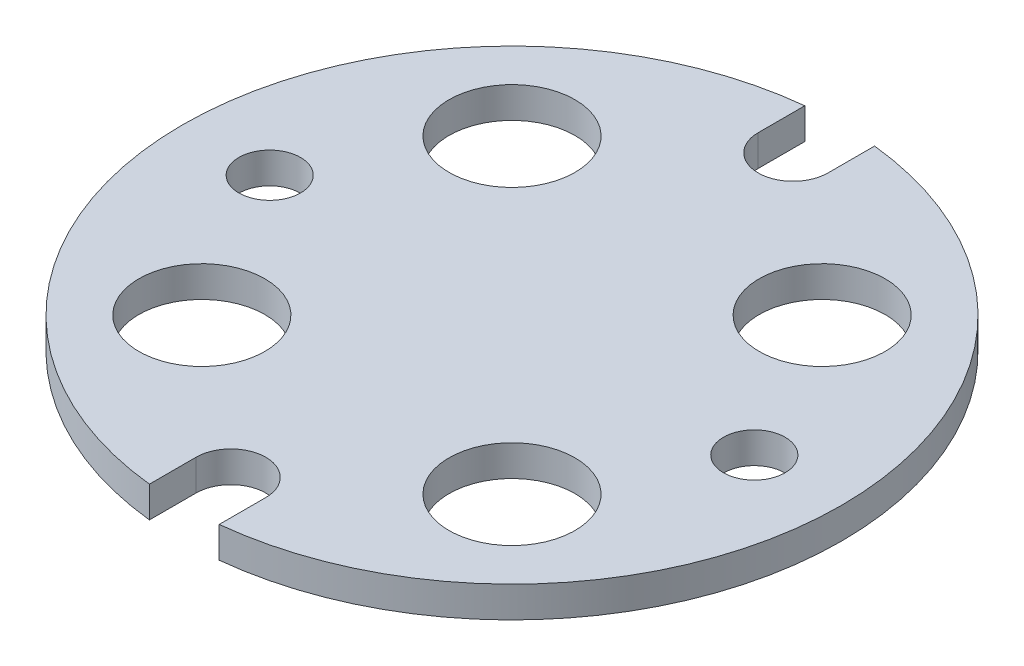
ISO-10303-21;
HEADER;
FILE_DESCRIPTION(('STEP AP214'),'2;1');
FILE_NAME('part.step','',(''),(''),'','','');
FILE_SCHEMA(('AUTOMOTIVE_DESIGN { 1 0 10303 214 1 1 1 1 }'));
ENDSEC;
DATA;
#1=APPLICATION_CONTEXT('core data for automotive mechanical design processes');
#2=APPLICATION_PROTOCOL_DEFINITION('international standard','automotive_design',2000,#1);
#3=PRODUCT_CONTEXT('',#1,'mechanical');
#4=PRODUCT('Part','Part','',(#3));
#5=PRODUCT_RELATED_PRODUCT_CATEGORY('part','',(#4));
#6=PRODUCT_DEFINITION_FORMATION('','',#4);
#7=PRODUCT_DEFINITION_CONTEXT('part definition',#1,'design');
#8=PRODUCT_DEFINITION('design','',#6,#7);
#9=PRODUCT_DEFINITION_SHAPE('','',#8);
#10=(LENGTH_UNIT() NAMED_UNIT(*) SI_UNIT(.MILLI.,.METRE.));
#11=(NAMED_UNIT(*) PLANE_ANGLE_UNIT() SI_UNIT($,.RADIAN.));
#12=(NAMED_UNIT(*) SI_UNIT($,.STERADIAN.) SOLID_ANGLE_UNIT());
#13=UNCERTAINTY_MEASURE_WITH_UNIT(LENGTH_MEASURE(1.E-05),#10,'distance_accuracy_value','');
#14=(GEOMETRIC_REPRESENTATION_CONTEXT(3) GLOBAL_UNCERTAINTY_ASSIGNED_CONTEXT((#13)) GLOBAL_UNIT_ASSIGNED_CONTEXT((#10,
#11,#12)) REPRESENTATION_CONTEXT('',''));
#15=CARTESIAN_POINT('',(0.,0.,0.));
#16=DIRECTION('',(0.,0.,1.));
#17=DIRECTION('',(1.,0.,0.));
#18=AXIS2_PLACEMENT_3D('',#15,#16,#17);
#19=CARTESIAN_POINT('',(0.,1.6,0.));
#20=DIRECTION('',(0.,-1.,0.));
#21=DIRECTION('',(0.,0.,-1.));
#22=AXIS2_PLACEMENT_3D('',#19,#20,#21);
#23=CYLINDRICAL_SURFACE('',#22,17.);
#24=CARTESIAN_POINT('',(0.,0.,0.));
#25=DIRECTION('',(0.,1.,0.));
#26=DIRECTION('',(0.,0.,1.));
#27=AXIS2_PLACEMENT_3D('',#24,#25,#26);
#28=CIRCLE('',#27,17.);
#29=CARTESIAN_POINT('',(1.80000000000001,0.,16.9044372872923));
#30=VERTEX_POINT('',#29);
#31=CARTESIAN_POINT('',(1.79999999999796,0.,-16.9044372872926));
#32=VERTEX_POINT('',#31);
#33=EDGE_CURVE('E38',#30,#32,#28,.T.);
#34=ORIENTED_EDGE('',*,*,#33,.T.);
#35=DIRECTION('',(0.,-1.,0.));
#36=VECTOR('',#35,1.);
#37=CARTESIAN_POINT('',(1.79999999999796,1.6,-16.9044372872926));
#38=LINE('',#37,#36);
#39=CARTESIAN_POINT('',(1.79999999999796,1.6,-16.9044372872926));
#40=VERTEX_POINT('',#39);
#41=EDGE_CURVE('E133',#40,#32,#38,.T.);
#42=ORIENTED_EDGE('',*,*,#41,.F.);
#43=CARTESIAN_POINT('',(0.,1.6,0.));
#44=DIRECTION('',(0.,1.,0.));
#45=DIRECTION('',(0.,0.,1.));
#46=AXIS2_PLACEMENT_3D('',#43,#44,#45);
#47=CIRCLE('',#46,17.);
#48=CARTESIAN_POINT('',(1.80000000000001,1.6,16.9044372872923));
#49=VERTEX_POINT('',#48);
#50=EDGE_CURVE('E11',#49,#40,#47,.T.);
#51=ORIENTED_EDGE('',*,*,#50,.F.);
#52=DIRECTION('',(0.,-1.,0.));
#53=VECTOR('',#52,1.);
#54=CARTESIAN_POINT('',(1.80000000000001,1.6,16.9044372872923));
#55=LINE('',#54,#53);
#56=EDGE_CURVE('E182',#49,#30,#55,.T.);
#57=ORIENTED_EDGE('',*,*,#56,.T.);
#58=EDGE_LOOP('',(#34,#42,#51,#57));
#59=FACE_BOUND('',#58,.T.);
#60=ADVANCED_FACE('F34',(#59),#23,.T.);
#61=CARTESIAN_POINT('',(-1.80000000000203,1.6,-16.9044372872921));
#62=VERTEX_POINT('',#61);
#63=CARTESIAN_POINT('',(-1.79999999999999,1.6,16.9044372872924));
#64=VERTEX_POINT('',#63);
#65=EDGE_CURVE('E43',#62,#64,#47,.T.);
#66=ORIENTED_EDGE('',*,*,#65,.F.);
#67=DIRECTION('',(0.,-1.,0.));
#68=VECTOR('',#67,1.);
#69=CARTESIAN_POINT('',(-1.80000000000203,1.6,-16.9044372872921));
#70=LINE('',#69,#68);
#71=CARTESIAN_POINT('',(-1.80000000000203,0.,-16.9044372872921));
#72=VERTEX_POINT('',#71);
#73=EDGE_CURVE('E106',#62,#72,#70,.T.);
#74=ORIENTED_EDGE('',*,*,#73,.T.);
#75=CARTESIAN_POINT('',(-1.79999999999999,0.,16.9044372872924));
#76=VERTEX_POINT('',#75);
#77=EDGE_CURVE('E189',#72,#76,#28,.T.);
#78=ORIENTED_EDGE('',*,*,#77,.T.);
#79=DIRECTION('',(0.,-1.,0.));
#80=VECTOR('',#79,1.);
#81=CARTESIAN_POINT('',(-1.79999999999999,1.6,16.9044372872924));
#82=LINE('',#81,#80);
#83=EDGE_CURVE('E180',#64,#76,#82,.T.);
#84=ORIENTED_EDGE('',*,*,#83,.F.);
#85=EDGE_LOOP('',(#66,#74,#78,#84));
#86=FACE_BOUND('',#85,.T.);
#87=ADVANCED_FACE('F36',(#86),#23,.T.);
#88=CARTESIAN_POINT('',(0.,1.6,0.));
#89=DIRECTION('',(0.,1.,0.));
#90=DIRECTION('',(0.,0.,1.));
#91=AXIS2_PLACEMENT_3D('',#88,#89,#90);
#92=PLANE('',#91);
#93=CARTESIAN_POINT('',(8.00000000000053,1.6,-8.));
#94=DIRECTION('',(0.,-1.,0.));
#95=DIRECTION('',(0.,0.,-1.));
#96=AXIS2_PLACEMENT_3D('',#93,#94,#95);
#97=CIRCLE('',#96,3.25);
#98=CARTESIAN_POINT('',(8.00000000000053,1.6,-11.25));
#99=VERTEX_POINT('',#98);
#100=EDGE_CURVE('E136',#99,#99,#97,.T.);
#101=ORIENTED_EDGE('',*,*,#100,.T.);
#102=EDGE_LOOP('',(#101));
#103=FACE_BOUND('',#102,.T.);
#104=CARTESIAN_POINT('',(-7.99999999999947,1.6,-8.00000000000053));
#105=DIRECTION('',(0.,-1.,0.));
#106=DIRECTION('',(0.,0.,-1.));
#107=AXIS2_PLACEMENT_3D('',#104,#105,#106);
#108=CIRCLE('',#107,3.25);
#109=CARTESIAN_POINT('',(-7.99999999999947,1.6,-11.2500000000005));
#110=VERTEX_POINT('',#109);
#111=EDGE_CURVE('E142',#110,#110,#108,.T.);
#112=ORIENTED_EDGE('',*,*,#111,.T.);
#113=EDGE_LOOP('',(#112));
#114=FACE_BOUND('',#113,.T.);
#115=CARTESIAN_POINT('',(-8.,1.6,7.99999999999947));
#116=DIRECTION('',(0.,-1.,0.));
#117=DIRECTION('',(0.,0.,-1.));
#118=AXIS2_PLACEMENT_3D('',#115,#116,#117);
#119=CIRCLE('',#118,3.25);
#120=CARTESIAN_POINT('',(-8.,1.6,4.74999999999947));
#121=VERTEX_POINT('',#120);
#122=EDGE_CURVE('E148',#121,#121,#119,.T.);
#123=ORIENTED_EDGE('',*,*,#122,.T.);
#124=EDGE_LOOP('',(#123));
#125=FACE_BOUND('',#124,.T.);
#126=DIRECTION('',(1.20034163436477E-13,0.,1.));
#127=VECTOR('',#126,1.);
#128=CARTESIAN_POINT('',(1.79999999999825,1.6,-14.5));
#129=LINE('',#128,#127);
#130=CARTESIAN_POINT('',(1.79999999999825,1.6,-14.5));
#131=VERTEX_POINT('',#130);
#132=EDGE_CURVE('E107',#40,#131,#129,.T.);
#133=ORIENTED_EDGE('',*,*,#132,.T.);
#134=CARTESIAN_POINT('',(-1.74775222975309E-12,1.6,-14.4999999999997));
#135=DIRECTION('',(0.,-1.,0.));
#136=DIRECTION('',(0.,0.,-1.));
#137=AXIS2_PLACEMENT_3D('',#134,#135,#136);
#138=CIRCLE('',#137,1.8);
#139=CARTESIAN_POINT('',(-1.80000000000175,1.6,-14.4999999999995));
#140=VERTEX_POINT('',#139);
#141=EDGE_CURVE('E102',#131,#140,#138,.T.);
#142=ORIENTED_EDGE('',*,*,#141,.T.);
#143=DIRECTION('',(-1.20034163436477E-13,0.,-1.));
#144=VECTOR('',#143,1.);
#145=CARTESIAN_POINT('',(-1.80000000000175,1.6,-14.4999999999995));
#146=LINE('',#145,#144);
#147=EDGE_CURVE('E110',#140,#62,#146,.T.);
#148=ORIENTED_EDGE('',*,*,#147,.T.);
#149=ORIENTED_EDGE('',*,*,#65,.T.);
#150=DIRECTION('',(0.,0.,-1.));
#151=VECTOR('',#150,1.);
#152=CARTESIAN_POINT('',(-1.79999999999999,1.6,14.4999999999997));
#153=LINE('',#152,#151);
#154=CARTESIAN_POINT('',(-1.79999999999999,1.6,14.4999999999997));
#155=VERTEX_POINT('',#154);
#156=EDGE_CURVE('E170',#64,#155,#153,.T.);
#157=ORIENTED_EDGE('',*,*,#156,.T.);
#158=CARTESIAN_POINT('',(0.,1.6,14.4999999999997));
#159=DIRECTION('',(0.,-1.,0.));
#160=DIRECTION('',(0.,0.,-1.));
#161=AXIS2_PLACEMENT_3D('',#158,#159,#160);
#162=CIRCLE('',#161,1.8);
#163=CARTESIAN_POINT('',(1.80000000000001,1.6,14.4999999999997));
#164=VERTEX_POINT('',#163);
#165=EDGE_CURVE('E163',#155,#164,#162,.T.);
#166=ORIENTED_EDGE('',*,*,#165,.T.);
#167=DIRECTION('',(0.,0.,1.));
#168=VECTOR('',#167,1.);
#169=CARTESIAN_POINT('',(1.80000000000001,1.6,14.4999999999997));
#170=LINE('',#169,#168);
#171=EDGE_CURVE('E166',#164,#49,#170,.T.);
#172=ORIENTED_EDGE('',*,*,#171,.T.);
#173=ORIENTED_EDGE('',*,*,#50,.T.);
#174=EDGE_LOOP('',(#133,#142,#148,#149,#157,#166,#172,#173));
#175=FACE_BOUND('',#174,.T.);
#176=CARTESIAN_POINT('',(8.,1.6,8.));
#177=DIRECTION('',(0.,-1.,0.));
#178=DIRECTION('',(0.,0.,-1.));
#179=AXIS2_PLACEMENT_3D('',#176,#177,#178);
#180=CIRCLE('',#179,3.25);
#181=CARTESIAN_POINT('',(8.,1.6,4.75));
#182=VERTEX_POINT('',#181);
#183=EDGE_CURVE('E156',#182,#182,#180,.T.);
#184=ORIENTED_EDGE('',*,*,#183,.T.);
#185=EDGE_LOOP('',(#184));
#186=FACE_BOUND('',#185,.T.);
#187=CARTESIAN_POINT('',(-12.5,1.6,0.));
#188=DIRECTION('',(0.,-1.,0.));
#189=DIRECTION('',(0.,0.,-1.));
#190=AXIS2_PLACEMENT_3D('',#187,#188,#189);
#191=CIRCLE('',#190,1.59);
#192=CARTESIAN_POINT('',(-12.5,1.6,-1.59));
#193=VERTEX_POINT('',#192);
#194=EDGE_CURVE('E149',#193,#193,#191,.T.);
#195=ORIENTED_EDGE('',*,*,#194,.T.);
#196=EDGE_LOOP('',(#195));
#197=FACE_BOUND('',#196,.T.);
#198=CARTESIAN_POINT('',(12.5,1.6,0.));
#199=DIRECTION('',(0.,-1.,0.));
#200=DIRECTION('',(0.,0.,-1.));
#201=AXIS2_PLACEMENT_3D('',#198,#199,#200);
#202=CIRCLE('',#201,1.59);
#203=CARTESIAN_POINT('',(12.5,1.6,-1.59));
#204=VERTEX_POINT('',#203);
#205=EDGE_CURVE('E186',#204,#204,#202,.T.);
#206=ORIENTED_EDGE('',*,*,#205,.T.);
#207=EDGE_LOOP('',(#206));
#208=FACE_BOUND('',#207,.T.);
#209=ADVANCED_FACE('F117',(#103,#114,#125,#175,#186,#197,#208),#92,.T.);
#210=CARTESIAN_POINT('',(0.,0.,0.));
#211=DIRECTION('',(0.,1.,0.));
#212=DIRECTION('',(0.,0.,1.));
#213=AXIS2_PLACEMENT_3D('',#210,#211,#212);
#214=PLANE('',#213);
#215=CARTESIAN_POINT('',(8.00000000000053,0.,-8.));
#216=DIRECTION('',(0.,-1.,0.));
#217=DIRECTION('',(0.,0.,-1.));
#218=AXIS2_PLACEMENT_3D('',#215,#216,#217);
#219=CIRCLE('',#218,3.25);
#220=CARTESIAN_POINT('',(8.00000000000053,0.,-11.25));
#221=VERTEX_POINT('',#220);
#222=EDGE_CURVE('E139',#221,#221,#219,.T.);
#223=ORIENTED_EDGE('',*,*,#222,.F.);
#224=EDGE_LOOP('',(#223));
#225=FACE_BOUND('',#224,.T.);
#226=CARTESIAN_POINT('',(-7.99999999999947,0.,-8.00000000000053));
#227=DIRECTION('',(0.,-1.,0.));
#228=DIRECTION('',(0.,0.,-1.));
#229=AXIS2_PLACEMENT_3D('',#226,#227,#228);
#230=CIRCLE('',#229,3.25);
#231=CARTESIAN_POINT('',(-7.99999999999947,0.,-11.2500000000005));
#232=VERTEX_POINT('',#231);
#233=EDGE_CURVE('E145',#232,#232,#230,.T.);
#234=ORIENTED_EDGE('',*,*,#233,.F.);
#235=EDGE_LOOP('',(#234));
#236=FACE_BOUND('',#235,.T.);
#237=CARTESIAN_POINT('',(-8.,0.,7.99999999999947));
#238=DIRECTION('',(0.,-1.,0.));
#239=DIRECTION('',(0.,0.,-1.));
#240=AXIS2_PLACEMENT_3D('',#237,#238,#239);
#241=CIRCLE('',#240,3.25);
#242=CARTESIAN_POINT('',(-8.,0.,4.74999999999947));
#243=VERTEX_POINT('',#242);
#244=EDGE_CURVE('E125',#243,#243,#241,.T.);
#245=ORIENTED_EDGE('',*,*,#244,.F.);
#246=EDGE_LOOP('',(#245));
#247=FACE_BOUND('',#246,.T.);
#248=CARTESIAN_POINT('',(8.,0.,8.));
#249=DIRECTION('',(0.,-1.,0.));
#250=DIRECTION('',(0.,0.,-1.));
#251=AXIS2_PLACEMENT_3D('',#248,#249,#250);
#252=CIRCLE('',#251,3.25);
#253=CARTESIAN_POINT('',(8.,0.,4.75));
#254=VERTEX_POINT('',#253);
#255=EDGE_CURVE('E159',#254,#254,#252,.T.);
#256=ORIENTED_EDGE('',*,*,#255,.F.);
#257=EDGE_LOOP('',(#256));
#258=FACE_BOUND('',#257,.T.);
#259=CARTESIAN_POINT('',(-12.5,0.,0.));
#260=DIRECTION('',(0.,-1.,0.));
#261=DIRECTION('',(0.,0.,-1.));
#262=AXIS2_PLACEMENT_3D('',#259,#260,#261);
#263=CIRCLE('',#262,1.59);
#264=CARTESIAN_POINT('',(-12.5,0.,-1.59));
#265=VERTEX_POINT('',#264);
#266=EDGE_CURVE('E153',#265,#265,#263,.T.);
#267=ORIENTED_EDGE('',*,*,#266,.F.);
#268=EDGE_LOOP('',(#267));
#269=FACE_BOUND('',#268,.T.);
#270=CARTESIAN_POINT('',(12.5,0.,0.));
#271=DIRECTION('',(0.,-1.,0.));
#272=DIRECTION('',(0.,0.,-1.));
#273=AXIS2_PLACEMENT_3D('',#270,#271,#272);
#274=CIRCLE('',#273,1.59);
#275=CARTESIAN_POINT('',(12.5,0.,-1.59));
#276=VERTEX_POINT('',#275);
#277=EDGE_CURVE('E152',#276,#276,#274,.T.);
#278=ORIENTED_EDGE('',*,*,#277,.F.);
#279=EDGE_LOOP('',(#278));
#280=FACE_BOUND('',#279,.T.);
#281=CARTESIAN_POINT('',(-1.74775222975309E-12,0.,-14.4999999999997));
#282=DIRECTION('',(0.,-1.,0.));
#283=DIRECTION('',(0.,0.,-1.));
#284=AXIS2_PLACEMENT_3D('',#281,#282,#283);
#285=CIRCLE('',#284,1.8);
#286=CARTESIAN_POINT('',(1.79999999999825,0.,-14.5));
#287=VERTEX_POINT('',#286);
#288=CARTESIAN_POINT('',(-1.80000000000175,0.,-14.4999999999995));
#289=VERTEX_POINT('',#288);
#290=EDGE_CURVE('E50',#287,#289,#285,.T.);
#291=ORIENTED_EDGE('',*,*,#290,.F.);
#292=DIRECTION('',(1.20034163436477E-13,0.,1.));
#293=VECTOR('',#292,1.);
#294=CARTESIAN_POINT('',(1.79999999999825,0.,-14.5));
#295=LINE('',#294,#293);
#296=EDGE_CURVE('E119',#32,#287,#295,.T.);
#297=ORIENTED_EDGE('',*,*,#296,.F.);
#298=ORIENTED_EDGE('',*,*,#33,.F.);
#299=DIRECTION('',(0.,0.,1.));
#300=VECTOR('',#299,1.);
#301=CARTESIAN_POINT('',(1.80000000000001,0.,14.4999999999997));
#302=LINE('',#301,#300);
#303=CARTESIAN_POINT('',(1.80000000000001,0.,14.4999999999997));
#304=VERTEX_POINT('',#303);
#305=EDGE_CURVE('E175',#304,#30,#302,.T.);
#306=ORIENTED_EDGE('',*,*,#305,.F.);
#307=CARTESIAN_POINT('',(0.,0.,14.4999999999997));
#308=DIRECTION('',(0.,-1.,0.));
#309=DIRECTION('',(0.,0.,-1.));
#310=AXIS2_PLACEMENT_3D('',#307,#308,#309);
#311=CIRCLE('',#310,1.8);
#312=CARTESIAN_POINT('',(-1.79999999999999,0.,14.4999999999997));
#313=VERTEX_POINT('',#312);
#314=EDGE_CURVE('E58',#313,#304,#311,.T.);
#315=ORIENTED_EDGE('',*,*,#314,.F.);
#316=DIRECTION('',(0.,0.,-1.));
#317=VECTOR('',#316,1.);
#318=CARTESIAN_POINT('',(-1.79999999999999,0.,14.4999999999997));
#319=LINE('',#318,#317);
#320=EDGE_CURVE('E167',#76,#313,#319,.T.);
#321=ORIENTED_EDGE('',*,*,#320,.F.);
#322=ORIENTED_EDGE('',*,*,#77,.F.);
#323=DIRECTION('',(-1.20034163436477E-13,0.,-1.));
#324=VECTOR('',#323,1.);
#325=CARTESIAN_POINT('',(-1.80000000000175,0.,-14.4999999999995));
#326=LINE('',#325,#324);
#327=EDGE_CURVE('E122',#289,#72,#326,.T.);
#328=ORIENTED_EDGE('',*,*,#327,.F.);
#329=EDGE_LOOP('',(#291,#297,#298,#306,#315,#321,#322,#328));
#330=FACE_BOUND('',#329,.T.);
#331=ADVANCED_FACE('F195',(#225,#236,#247,#258,#269,#280,#330),#214,.F.);
#332=CARTESIAN_POINT('',(12.5,1.6,0.));
#333=DIRECTION('',(0.,-1.,0.));
#334=DIRECTION('',(0.,0.,-1.));
#335=AXIS2_PLACEMENT_3D('',#332,#333,#334);
#336=CYLINDRICAL_SURFACE('',#335,1.59);
#337=ORIENTED_EDGE('',*,*,#205,.F.);
#338=EDGE_LOOP('',(#337));
#339=FACE_BOUND('',#338,.T.);
#340=ORIENTED_EDGE('',*,*,#277,.T.);
#341=EDGE_LOOP('',(#340));
#342=FACE_BOUND('',#341,.T.);
#343=ADVANCED_FACE('F193',(#339,#342),#336,.F.);
#344=CARTESIAN_POINT('',(-12.5,1.6,0.));
#345=DIRECTION('',(0.,-1.,0.));
#346=DIRECTION('',(0.,0.,-1.));
#347=AXIS2_PLACEMENT_3D('',#344,#345,#346);
#348=CYLINDRICAL_SURFACE('',#347,1.59);
#349=ORIENTED_EDGE('',*,*,#194,.F.);
#350=EDGE_LOOP('',(#349));
#351=FACE_BOUND('',#350,.T.);
#352=ORIENTED_EDGE('',*,*,#266,.T.);
#353=EDGE_LOOP('',(#352));
#354=FACE_BOUND('',#353,.T.);
#355=ADVANCED_FACE('F242',(#351,#354),#348,.F.);
#356=CARTESIAN_POINT('',(8.,1.6,8.));
#357=DIRECTION('',(0.,-1.,0.));
#358=DIRECTION('',(0.,0.,-1.));
#359=AXIS2_PLACEMENT_3D('',#356,#357,#358);
#360=CYLINDRICAL_SURFACE('',#359,3.25);
#361=ORIENTED_EDGE('',*,*,#183,.F.);
#362=EDGE_LOOP('',(#361));
#363=FACE_BOUND('',#362,.T.);
#364=ORIENTED_EDGE('',*,*,#255,.T.);
#365=EDGE_LOOP('',(#364));
#366=FACE_BOUND('',#365,.T.);
#367=ADVANCED_FACE('F225',(#363,#366),#360,.F.);
#368=CARTESIAN_POINT('',(0.,1.6,14.4999999999997));
#369=DIRECTION('',(0.,-1.,0.));
#370=DIRECTION('',(0.,0.,-1.));
#371=AXIS2_PLACEMENT_3D('',#368,#369,#370);
#372=CYLINDRICAL_SURFACE('',#371,1.8);
#373=ORIENTED_EDGE('',*,*,#314,.T.);
#374=DIRECTION('',(0.,-1.,0.));
#375=VECTOR('',#374,1.);
#376=CARTESIAN_POINT('',(1.80000000000001,1.6,14.4999999999997));
#377=LINE('',#376,#375);
#378=EDGE_CURVE('E173',#164,#304,#377,.T.);
#379=ORIENTED_EDGE('',*,*,#378,.F.);
#380=ORIENTED_EDGE('',*,*,#165,.F.);
#381=DIRECTION('',(0.,-1.,0.));
#382=VECTOR('',#381,1.);
#383=CARTESIAN_POINT('',(-1.79999999999999,1.6,14.4999999999997));
#384=LINE('',#383,#382);
#385=EDGE_CURVE('E162',#155,#313,#384,.T.);
#386=ORIENTED_EDGE('',*,*,#385,.T.);
#387=EDGE_LOOP('',(#373,#379,#380,#386));
#388=FACE_BOUND('',#387,.T.);
#389=ADVANCED_FACE('F215',(#388),#372,.F.);
#390=CARTESIAN_POINT('',(-1.79999999999999,1.6,14.4999999999997));
#391=DIRECTION('',(-1.,0.,0.));
#392=DIRECTION('',(0.,0.,1.));
#393=AXIS2_PLACEMENT_3D('',#390,#391,#392);
#394=PLANE('',#393);
#395=ORIENTED_EDGE('',*,*,#320,.T.);
#396=ORIENTED_EDGE('',*,*,#385,.F.);
#397=ORIENTED_EDGE('',*,*,#156,.F.);
#398=ORIENTED_EDGE('',*,*,#83,.T.);
#399=EDGE_LOOP('',(#395,#396,#397,#398));
#400=FACE_BOUND('',#399,.T.);
#401=ADVANCED_FACE('F217',(#400),#394,.F.);
#402=CARTESIAN_POINT('',(1.80000000000001,1.6,14.4999999999997));
#403=DIRECTION('',(1.,0.,0.));
#404=DIRECTION('',(0.,0.,-1.));
#405=AXIS2_PLACEMENT_3D('',#402,#403,#404);
#406=PLANE('',#405);
#407=ORIENTED_EDGE('',*,*,#305,.T.);
#408=ORIENTED_EDGE('',*,*,#56,.F.);
#409=ORIENTED_EDGE('',*,*,#171,.F.);
#410=ORIENTED_EDGE('',*,*,#378,.T.);
#411=EDGE_LOOP('',(#407,#408,#409,#410));
#412=FACE_BOUND('',#411,.T.);
#413=ADVANCED_FACE('F212',(#412),#406,.F.);
#414=CARTESIAN_POINT('',(-1.74775222975309E-12,1.6,-14.4999999999997));
#415=DIRECTION('',(0.,-1.,0.));
#416=DIRECTION('',(0.,0.,-1.));
#417=AXIS2_PLACEMENT_3D('',#414,#415,#416);
#418=CYLINDRICAL_SURFACE('',#417,1.8);
#419=ORIENTED_EDGE('',*,*,#290,.T.);
#420=DIRECTION('',(0.,-1.,0.));
#421=VECTOR('',#420,1.);
#422=CARTESIAN_POINT('',(-1.80000000000175,1.6,-14.4999999999995));
#423=LINE('',#422,#421);
#424=EDGE_CURVE('E98',#140,#289,#423,.T.);
#425=ORIENTED_EDGE('',*,*,#424,.F.);
#426=ORIENTED_EDGE('',*,*,#141,.F.);
#427=DIRECTION('',(0.,-1.,0.));
#428=VECTOR('',#427,1.);
#429=CARTESIAN_POINT('',(1.79999999999825,1.6,-14.5));
#430=LINE('',#429,#428);
#431=EDGE_CURVE('E131',#131,#287,#430,.T.);
#432=ORIENTED_EDGE('',*,*,#431,.T.);
#433=EDGE_LOOP('',(#419,#425,#426,#432));
#434=FACE_BOUND('',#433,.T.);
#435=ADVANCED_FACE('F100',(#434),#418,.F.);
#436=CARTESIAN_POINT('',(1.79999999999825,1.6,-14.5));
#437=DIRECTION('',(1.,0.,-1.20034163436477E-13));
#438=DIRECTION('',(-1.20034163436477E-13,0.,-1.));
#439=AXIS2_PLACEMENT_3D('',#436,#437,#438);
#440=PLANE('',#439);
#441=ORIENTED_EDGE('',*,*,#296,.T.);
#442=ORIENTED_EDGE('',*,*,#431,.F.);
#443=ORIENTED_EDGE('',*,*,#132,.F.);
#444=ORIENTED_EDGE('',*,*,#41,.T.);
#445=EDGE_LOOP('',(#441,#442,#443,#444));
#446=FACE_BOUND('',#445,.T.);
#447=ADVANCED_FACE('F269',(#446),#440,.F.);
#448=CARTESIAN_POINT('',(-1.80000000000175,1.6,-14.4999999999995));
#449=DIRECTION('',(-1.,0.,1.20034163436477E-13));
#450=DIRECTION('',(1.20034163436477E-13,0.,1.));
#451=AXIS2_PLACEMENT_3D('',#448,#449,#450);
#452=PLANE('',#451);
#453=ORIENTED_EDGE('',*,*,#327,.T.);
#454=ORIENTED_EDGE('',*,*,#73,.F.);
#455=ORIENTED_EDGE('',*,*,#147,.F.);
#456=ORIENTED_EDGE('',*,*,#424,.T.);
#457=EDGE_LOOP('',(#453,#454,#455,#456));
#458=FACE_BOUND('',#457,.T.);
#459=ADVANCED_FACE('F111',(#458),#452,.F.);
#460=CARTESIAN_POINT('',(-8.,1.6,7.99999999999947));
#461=DIRECTION('',(0.,-1.,0.));
#462=DIRECTION('',(0.,0.,-1.));
#463=AXIS2_PLACEMENT_3D('',#460,#461,#462);
#464=CYLINDRICAL_SURFACE('',#463,3.25);
#465=ORIENTED_EDGE('',*,*,#122,.F.);
#466=EDGE_LOOP('',(#465));
#467=FACE_BOUND('',#466,.T.);
#468=ORIENTED_EDGE('',*,*,#244,.T.);
#469=EDGE_LOOP('',(#468));
#470=FACE_BOUND('',#469,.T.);
#471=ADVANCED_FACE('F262',(#467,#470),#464,.F.);
#472=CARTESIAN_POINT('',(-7.99999999999947,1.6,-8.00000000000053));
#473=DIRECTION('',(0.,-1.,0.));
#474=DIRECTION('',(0.,0.,-1.));
#475=AXIS2_PLACEMENT_3D('',#472,#473,#474);
#476=CYLINDRICAL_SURFACE('',#475,3.25);
#477=ORIENTED_EDGE('',*,*,#111,.F.);
#478=EDGE_LOOP('',(#477));
#479=FACE_BOUND('',#478,.T.);
#480=ORIENTED_EDGE('',*,*,#233,.T.);
#481=EDGE_LOOP('',(#480));
#482=FACE_BOUND('',#481,.T.);
#483=ADVANCED_FACE('F258',(#479,#482),#476,.F.);
#484=CARTESIAN_POINT('',(8.00000000000053,1.6,-8.));
#485=DIRECTION('',(0.,-1.,0.));
#486=DIRECTION('',(0.,0.,-1.));
#487=AXIS2_PLACEMENT_3D('',#484,#485,#486);
#488=CYLINDRICAL_SURFACE('',#487,3.25);
#489=ORIENTED_EDGE('',*,*,#100,.F.);
#490=EDGE_LOOP('',(#489));
#491=FACE_BOUND('',#490,.T.);
#492=ORIENTED_EDGE('',*,*,#222,.T.);
#493=EDGE_LOOP('',(#492));
#494=FACE_BOUND('',#493,.T.);
#495=ADVANCED_FACE('F261',(#491,#494),#488,.F.);
#496=CLOSED_SHELL('',(#60,#87,#209,#331,#343,#355,#367,#389,#401,#413,#435,#447,#459,#471,#483,#495));
#497=MANIFOLD_SOLID_BREP('B2',#496);
#498=ADVANCED_BREP_SHAPE_REPRESENTATION('',(#18,#497),#14);
#499=SHAPE_DEFINITION_REPRESENTATION(#9,#498);
ENDSEC;
END-ISO-10303-21;
